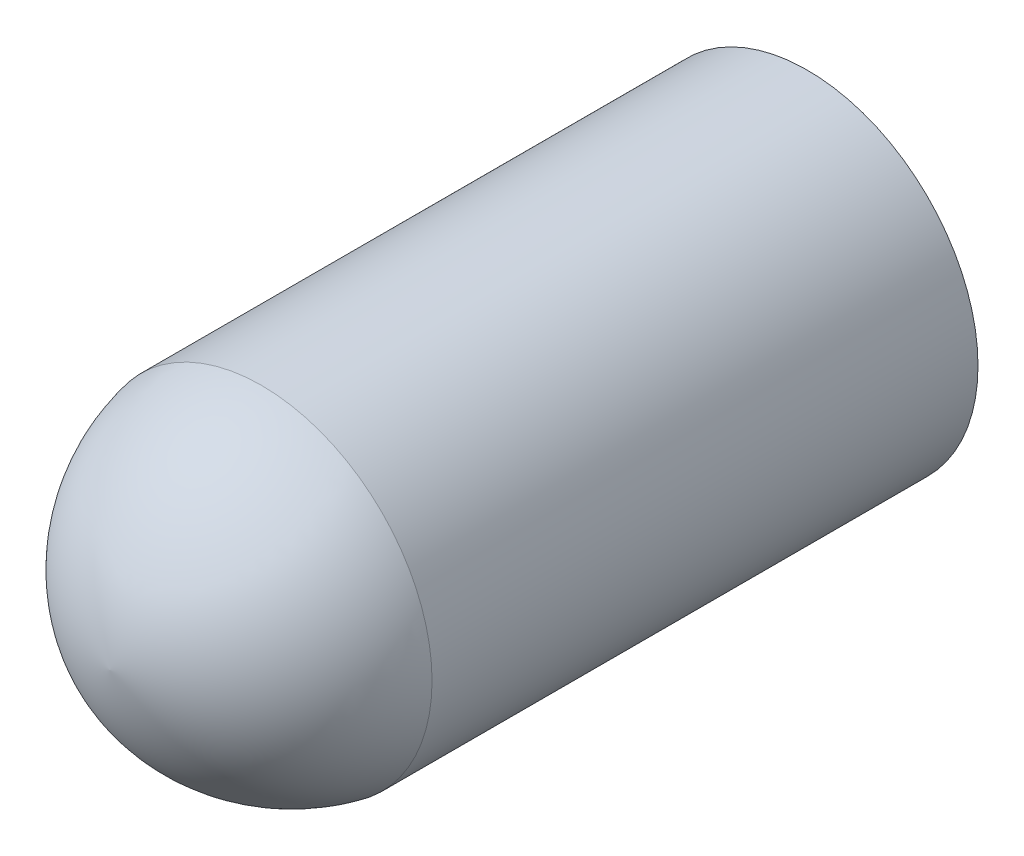
ISO-10303-21;
HEADER;
FILE_DESCRIPTION(('STEP AP214'),'2;1');
FILE_NAME('part.step','',(''),(''),'','','');
FILE_SCHEMA(('AUTOMOTIVE_DESIGN { 1 0 10303 214 1 1 1 1 }'));
ENDSEC;
DATA;
#1=APPLICATION_CONTEXT('core data for automotive mechanical design processes');
#2=APPLICATION_PROTOCOL_DEFINITION('international standard','automotive_design',2000,#1);
#3=PRODUCT_CONTEXT('',#1,'mechanical');
#4=PRODUCT('Part','Part','',(#3));
#5=PRODUCT_RELATED_PRODUCT_CATEGORY('part','',(#4));
#6=PRODUCT_DEFINITION_FORMATION('','',#4);
#7=PRODUCT_DEFINITION_CONTEXT('part definition',#1,'design');
#8=PRODUCT_DEFINITION('design','',#6,#7);
#9=PRODUCT_DEFINITION_SHAPE('','',#8);
#10=(LENGTH_UNIT() NAMED_UNIT(*) SI_UNIT(.MILLI.,.METRE.));
#11=(NAMED_UNIT(*) PLANE_ANGLE_UNIT() SI_UNIT($,.RADIAN.));
#12=(NAMED_UNIT(*) SI_UNIT($,.STERADIAN.) SOLID_ANGLE_UNIT());
#13=UNCERTAINTY_MEASURE_WITH_UNIT(LENGTH_MEASURE(1.E-05),#10,'distance_accuracy_value','');
#14=(GEOMETRIC_REPRESENTATION_CONTEXT(3) GLOBAL_UNCERTAINTY_ASSIGNED_CONTEXT((#13)) GLOBAL_UNIT_ASSIGNED_CONTEXT((#10,
#11,#12)) REPRESENTATION_CONTEXT('',''));
#15=CARTESIAN_POINT('',(0.,0.,0.));
#16=DIRECTION('',(0.,0.,1.));
#17=DIRECTION('',(1.,0.,0.));
#18=AXIS2_PLACEMENT_3D('',#15,#16,#17);
#19=CARTESIAN_POINT('',(0.,0.,36.));
#20=DIRECTION('',(0.,0.,-1.));
#21=DIRECTION('',(-1.,0.,0.));
#22=AXIS2_PLACEMENT_3D('',#19,#20,#21);
#23=CYLINDRICAL_SURFACE('',#22,22.5);
#24=CARTESIAN_POINT('',(0.,0.,36.));
#25=DIRECTION('',(0.,0.,1.));
#26=DIRECTION('',(1.,0.,0.));
#27=AXIS2_PLACEMENT_3D('',#24,#25,#26);
#28=CIRCLE('',#27,22.5);
#29=CARTESIAN_POINT('',(22.5,0.,36.));
#30=VERTEX_POINT('',#29);
#31=EDGE_CURVE('E11',#30,#30,#28,.T.);
#32=ORIENTED_EDGE('',*,*,#31,.F.);
#33=EDGE_LOOP('',(#32));
#34=FACE_BOUND('',#33,.T.);
#35=CARTESIAN_POINT('',(0.,0.,-36.));
#36=DIRECTION('',(0.,0.,1.));
#37=DIRECTION('',(1.,0.,0.));
#38=AXIS2_PLACEMENT_3D('',#35,#36,#37);
#39=CIRCLE('',#38,22.5);
#40=CARTESIAN_POINT('',(22.5,0.,-36.));
#41=VERTEX_POINT('',#40);
#42=EDGE_CURVE('E39',#41,#41,#39,.T.);
#43=ORIENTED_EDGE('',*,*,#42,.T.);
#44=EDGE_LOOP('',(#43));
#45=FACE_BOUND('',#44,.T.);
#46=ADVANCED_FACE('F36',(#34,#45),#23,.T.);
#47=CARTESIAN_POINT('',(0.,0.,-36.));
#48=DIRECTION('',(0.,0.,1.));
#49=DIRECTION('',(1.,0.,0.));
#50=AXIS2_PLACEMENT_3D('',#47,#48,#49);
#51=PLANE('',#50);
#52=CARTESIAN_POINT('',(0.,0.,-36.));
#53=DIRECTION('',(0.,0.,-1.));
#54=DIRECTION('',(-1.,0.,0.));
#55=AXIS2_PLACEMENT_3D('',#52,#53,#54);
#56=CIRCLE('',#55,15.);
#57=CARTESIAN_POINT('',(-15.,0.,-36.));
#58=VERTEX_POINT('',#57);
#59=EDGE_CURVE('E60',#58,#58,#56,.T.);
#60=ORIENTED_EDGE('',*,*,#59,.F.);
#61=EDGE_LOOP('',(#60));
#62=FACE_BOUND('',#61,.T.);
#63=ORIENTED_EDGE('',*,*,#42,.F.);
#64=EDGE_LOOP('',(#63));
#65=FACE_BOUND('',#64,.T.);
#66=ADVANCED_FACE('F49',(#62,#65),#51,.F.);
#67=CARTESIAN_POINT('',(0.,-2.01129967105477,31.0810378700634));
#68=DIRECTION('',(-1.,0.,0.));
#69=DIRECTION('',(0.,1.,0.));
#70=AXIS2_PLACEMENT_3D('',#67,#68,#69);
#71=CIRCLE('',#70,25.);
#72=TRIMMED_CURVE('',#71,(PARAMETER_VALUE(-1.49025729831479)),
(PARAMETER_VALUE(1.49025729831479)),.T.,.PARAMETER.);
#73=CARTESIAN_POINT('',(0.,0.,31.0810378700634));
#74=DIRECTION('',(0.,0.,-1.));
#75=AXIS1_PLACEMENT('',#73,#74);
#76=SURFACE_OF_REVOLUTION('',#72,#75);
#77=CARTESIAN_POINT('',(0.,0.,56.));
#78=VERTEX_POINT('',#77);
#79=VERTEX_LOOP('',#78);
#80=FACE_BOUND('',#79,.T.);
#81=ORIENTED_EDGE('',*,*,#31,.T.);
#82=EDGE_LOOP('',(#81));
#83=FACE_BOUND('',#82,.T.);
#84=ADVANCED_FACE('F45',(#80,#83),#76,.T.);
#85=CARTESIAN_POINT('',(0.,0.,-6.));
#86=DIRECTION('',(0.,0.,-1.));
#87=DIRECTION('',(-1.,0.,0.));
#88=AXIS2_PLACEMENT_3D('',#85,#86,#87);
#89=CYLINDRICAL_SURFACE('',#88,15.);
#90=CARTESIAN_POINT('',(0.,0.,-6.));
#91=DIRECTION('',(0.,0.,-1.));
#92=DIRECTION('',(-1.,0.,0.));
#93=AXIS2_PLACEMENT_3D('',#90,#91,#92);
#94=CIRCLE('',#93,15.);
#95=CARTESIAN_POINT('',(-15.,0.,-6.));
#96=VERTEX_POINT('',#95);
#97=EDGE_CURVE('E58',#96,#96,#94,.T.);
#98=ORIENTED_EDGE('',*,*,#97,.F.);
#99=EDGE_LOOP('',(#98));
#100=FACE_BOUND('',#99,.T.);
#101=ORIENTED_EDGE('',*,*,#59,.T.);
#102=EDGE_LOOP('',(#101));
#103=FACE_BOUND('',#102,.T.);
#104=ADVANCED_FACE('F48',(#100,#103),#89,.F.);
#105=CARTESIAN_POINT('',(0.,0.,-6.));
#106=DIRECTION('',(0.,0.,-1.));
#107=DIRECTION('',(-1.,0.,0.));
#108=AXIS2_PLACEMENT_3D('',#105,#106,#107);
#109=PLANE('',#108);
#110=ORIENTED_EDGE('',*,*,#97,.T.);
#111=EDGE_LOOP('',(#110));
#112=FACE_BOUND('',#111,.T.);
#113=ADVANCED_FACE('F75',(#112),#109,.T.);
#114=CLOSED_SHELL('',(#46,#66,#84,#104,#113));
#115=MANIFOLD_SOLID_BREP('B2',#114);
#116=ADVANCED_BREP_SHAPE_REPRESENTATION('',(#18,#115),#14);
#117=SHAPE_DEFINITION_REPRESENTATION(#9,#116);
ENDSEC;
END-ISO-10303-21;
